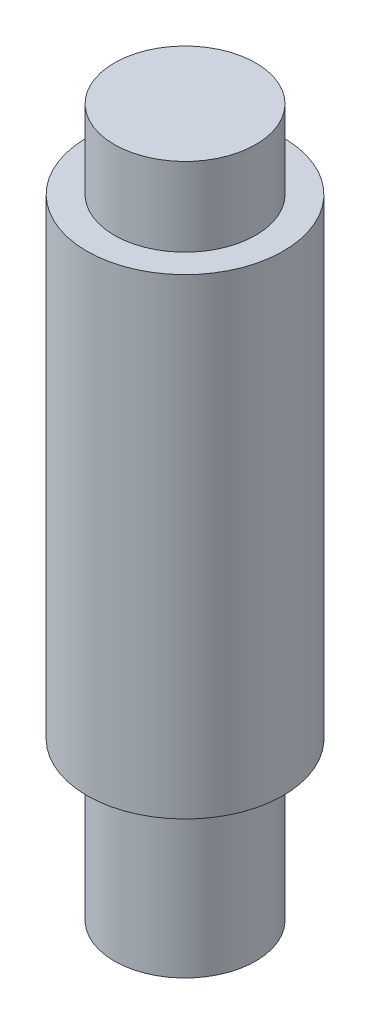
ISO-10303-21;
HEADER;
FILE_DESCRIPTION(('STEP AP214'),'2;1');
FILE_NAME('part.step','',(''),(''),'','','');
FILE_SCHEMA(('AUTOMOTIVE_DESIGN { 1 0 10303 214 1 1 1 1 }'));
ENDSEC;
DATA;
#1=APPLICATION_CONTEXT('core data for automotive mechanical design processes');
#2=APPLICATION_PROTOCOL_DEFINITION('international standard','automotive_design',2000,#1);
#3=PRODUCT_CONTEXT('',#1,'mechanical');
#4=PRODUCT('Part','Part','',(#3));
#5=PRODUCT_RELATED_PRODUCT_CATEGORY('part','',(#4));
#6=PRODUCT_DEFINITION_FORMATION('','',#4);
#7=PRODUCT_DEFINITION_CONTEXT('part definition',#1,'design');
#8=PRODUCT_DEFINITION('design','',#6,#7);
#9=PRODUCT_DEFINITION_SHAPE('','',#8);
#10=(LENGTH_UNIT() NAMED_UNIT(*) SI_UNIT(.MILLI.,.METRE.));
#11=(NAMED_UNIT(*) PLANE_ANGLE_UNIT() SI_UNIT($,.RADIAN.));
#12=(NAMED_UNIT(*) SI_UNIT($,.STERADIAN.) SOLID_ANGLE_UNIT());
#13=UNCERTAINTY_MEASURE_WITH_UNIT(LENGTH_MEASURE(1.E-05),#10,'distance_accuracy_value','');
#14=(GEOMETRIC_REPRESENTATION_CONTEXT(3) GLOBAL_UNCERTAINTY_ASSIGNED_CONTEXT((#13)) GLOBAL_UNIT_ASSIGNED_CONTEXT((#10,
#11,#12)) REPRESENTATION_CONTEXT('',''));
#15=CARTESIAN_POINT('',(0.,0.,0.));
#16=DIRECTION('',(0.,0.,1.));
#17=DIRECTION('',(1.,0.,0.));
#18=AXIS2_PLACEMENT_3D('',#15,#16,#17);
#19=CARTESIAN_POINT('',(0.,2.,0.));
#20=DIRECTION('',(0.,-1.,0.));
#21=DIRECTION('',(0.,0.,-1.));
#22=AXIS2_PLACEMENT_3D('',#19,#20,#21);
#23=CYLINDRICAL_SURFACE('',#22,0.9);
#24=CARTESIAN_POINT('',(0.,2.,0.));
#25=DIRECTION('',(0.,1.,0.));
#26=DIRECTION('',(0.,0.,1.));
#27=AXIS2_PLACEMENT_3D('',#24,#25,#26);
#28=CIRCLE('',#27,0.9);
#29=CARTESIAN_POINT('',(0.,2.,0.9));
#30=VERTEX_POINT('',#29);
#31=EDGE_CURVE('E51',#30,#30,#28,.T.);
#32=ORIENTED_EDGE('',*,*,#31,.F.);
#33=EDGE_LOOP('',(#32));
#34=FACE_BOUND('',#33,.T.);
#35=CARTESIAN_POINT('',(0.,0.,0.));
#36=DIRECTION('',(0.,1.,0.));
#37=DIRECTION('',(0.,0.,1.));
#38=AXIS2_PLACEMENT_3D('',#35,#36,#37);
#39=CIRCLE('',#38,0.9);
#40=CARTESIAN_POINT('',(0.,0.,0.9));
#41=VERTEX_POINT('',#40);
#42=EDGE_CURVE('E46',#41,#41,#39,.T.);
#43=ORIENTED_EDGE('',*,*,#42,.T.);
#44=EDGE_LOOP('',(#43));
#45=FACE_BOUND('',#44,.T.);
#46=ADVANCED_FACE('F43',(#34,#45),#23,.T.);
#47=CARTESIAN_POINT('',(0.,0.,0.));
#48=DIRECTION('',(0.,1.,0.));
#49=DIRECTION('',(0.,0.,1.));
#50=AXIS2_PLACEMENT_3D('',#47,#48,#49);
#51=PLANE('',#50);
#52=ORIENTED_EDGE('',*,*,#42,.F.);
#53=EDGE_LOOP('',(#52));
#54=FACE_BOUND('',#53,.T.);
#55=ADVANCED_FACE('F90',(#54),#51,.F.);
#56=CARTESIAN_POINT('',(0.,8.,0.));
#57=DIRECTION('',(0.,-1.,0.));
#58=DIRECTION('',(0.,0.,-1.));
#59=AXIS2_PLACEMENT_3D('',#56,#57,#58);
#60=CYLINDRICAL_SURFACE('',#59,1.25);
#61=CARTESIAN_POINT('',(0.,8.,0.));
#62=DIRECTION('',(0.,1.,0.));
#63=DIRECTION('',(0.,0.,1.));
#64=AXIS2_PLACEMENT_3D('',#61,#62,#63);
#65=CIRCLE('',#64,1.25);
#66=CARTESIAN_POINT('',(0.,8.,1.25));
#67=VERTEX_POINT('',#66);
#68=EDGE_CURVE('E60',#67,#67,#65,.T.);
#69=ORIENTED_EDGE('',*,*,#68,.F.);
#70=EDGE_LOOP('',(#69));
#71=FACE_BOUND('',#70,.T.);
#72=CARTESIAN_POINT('',(0.,2.,0.));
#73=DIRECTION('',(0.,1.,0.));
#74=DIRECTION('',(0.,0.,1.));
#75=AXIS2_PLACEMENT_3D('',#72,#73,#74);
#76=CIRCLE('',#75,1.25);
#77=CARTESIAN_POINT('',(0.,2.,1.25));
#78=VERTEX_POINT('',#77);
#79=EDGE_CURVE('E64',#78,#78,#76,.T.);
#80=ORIENTED_EDGE('',*,*,#79,.T.);
#81=EDGE_LOOP('',(#80));
#82=FACE_BOUND('',#81,.T.);
#83=ADVANCED_FACE('F95',(#71,#82),#60,.T.);
#84=CARTESIAN_POINT('',(0.,8.,0.));
#85=DIRECTION('',(0.,1.,0.));
#86=DIRECTION('',(0.,0.,1.));
#87=AXIS2_PLACEMENT_3D('',#84,#85,#86);
#88=PLANE('',#87);
#89=CARTESIAN_POINT('',(0.,8.,0.));
#90=DIRECTION('',(0.,1.,0.));
#91=DIRECTION('',(0.,0.,1.));
#92=AXIS2_PLACEMENT_3D('',#89,#90,#91);
#93=CIRCLE('',#92,0.9);
#94=CARTESIAN_POINT('',(0.,8.,0.9));
#95=VERTEX_POINT('',#94);
#96=EDGE_CURVE('E10',#95,#95,#93,.T.);
#97=ORIENTED_EDGE('',*,*,#96,.F.);
#98=EDGE_LOOP('',(#97));
#99=FACE_BOUND('',#98,.T.);
#100=ORIENTED_EDGE('',*,*,#68,.T.);
#101=EDGE_LOOP('',(#100));
#102=FACE_BOUND('',#101,.T.);
#103=ADVANCED_FACE('F85',(#99,#102),#88,.T.);
#104=CARTESIAN_POINT('',(0.,2.,0.));
#105=DIRECTION('',(0.,1.,0.));
#106=DIRECTION('',(0.,0.,1.));
#107=AXIS2_PLACEMENT_3D('',#104,#105,#106);
#108=PLANE('',#107);
#109=ORIENTED_EDGE('',*,*,#31,.T.);
#110=EDGE_LOOP('',(#109));
#111=FACE_BOUND('',#110,.T.);
#112=ORIENTED_EDGE('',*,*,#79,.F.);
#113=EDGE_LOOP('',(#112));
#114=FACE_BOUND('',#113,.T.);
#115=ADVANCED_FACE('F77',(#111,#114),#108,.F.);
#116=CARTESIAN_POINT('',(0.,9.,0.));
#117=DIRECTION('',(0.,-1.,0.));
#118=DIRECTION('',(0.,0.,-1.));
#119=AXIS2_PLACEMENT_3D('',#116,#117,#118);
#120=CYLINDRICAL_SURFACE('',#119,0.9);
#121=CARTESIAN_POINT('',(0.,9.,0.));
#122=DIRECTION('',(0.,1.,0.));
#123=DIRECTION('',(0.,0.,1.));
#124=AXIS2_PLACEMENT_3D('',#121,#122,#123);
#125=CIRCLE('',#124,0.9);
#126=CARTESIAN_POINT('',(0.,9.,0.9));
#127=VERTEX_POINT('',#126);
#128=EDGE_CURVE('E59',#127,#127,#125,.T.);
#129=ORIENTED_EDGE('',*,*,#128,.F.);
#130=EDGE_LOOP('',(#129));
#131=FACE_BOUND('',#130,.T.);
#132=ORIENTED_EDGE('',*,*,#96,.T.);
#133=EDGE_LOOP('',(#132));
#134=FACE_BOUND('',#133,.T.);
#135=ADVANCED_FACE('F75',(#131,#134),#120,.T.);
#136=CARTESIAN_POINT('',(0.,9.,0.));
#137=DIRECTION('',(0.,1.,0.));
#138=DIRECTION('',(0.,0.,1.));
#139=AXIS2_PLACEMENT_3D('',#136,#137,#138);
#140=PLANE('',#139);
#141=ORIENTED_EDGE('',*,*,#128,.T.);
#142=EDGE_LOOP('',(#141));
#143=FACE_BOUND('',#142,.T.);
#144=ADVANCED_FACE('F73',(#143),#140,.T.);
#145=CLOSED_SHELL('',(#46,#55,#83,#103,#115,#135,#144));
#146=MANIFOLD_SOLID_BREP('B2',#145);
#147=ADVANCED_BREP_SHAPE_REPRESENTATION('',(#18,#146),#14);
#148=SHAPE_DEFINITION_REPRESENTATION(#9,#147);
ENDSEC;
END-ISO-10303-21;
